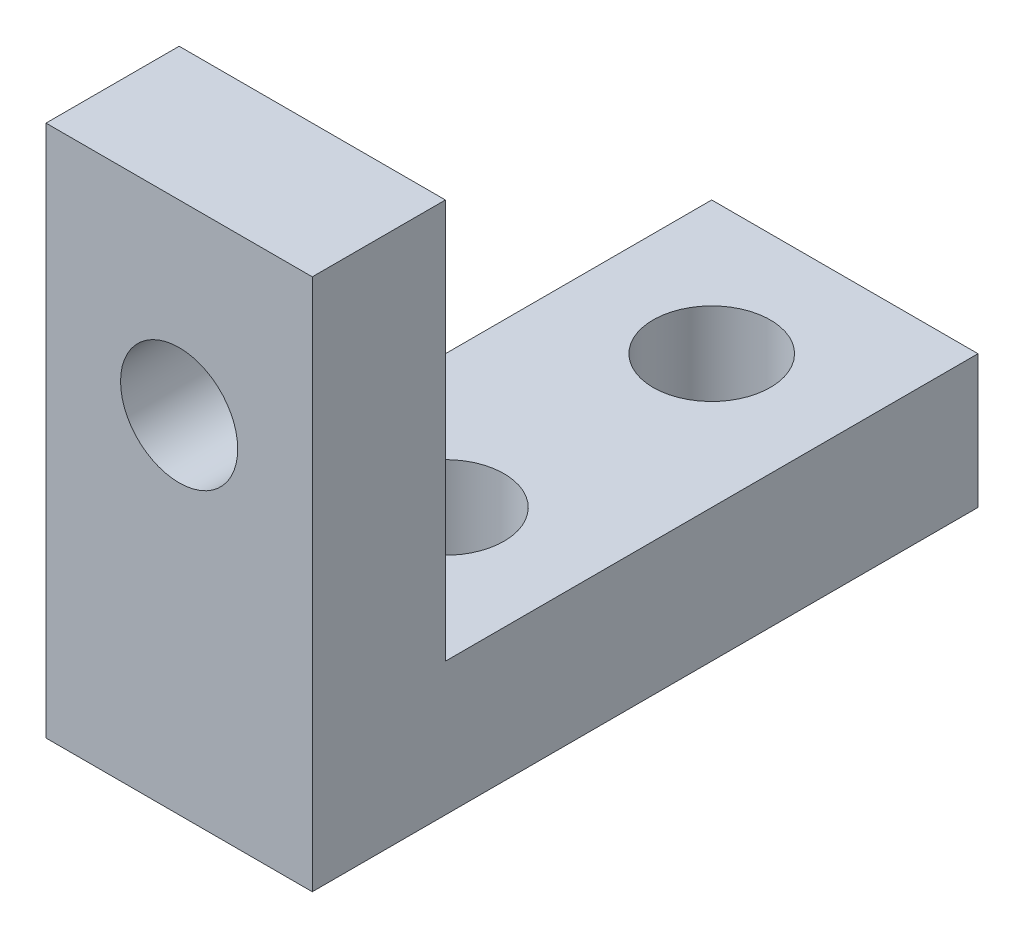
ISO-10303-21;
HEADER;
FILE_DESCRIPTION(('STEP AP214'),'2;1');
FILE_NAME('part.step','',(''),(''),'','','');
FILE_SCHEMA(('AUTOMOTIVE_DESIGN { 1 0 10303 214 1 1 1 1 }'));
ENDSEC;
DATA;
#1=APPLICATION_CONTEXT('core data for automotive mechanical design processes');
#2=APPLICATION_PROTOCOL_DEFINITION('international standard','automotive_design',2000,#1);
#3=PRODUCT_CONTEXT('',#1,'mechanical');
#4=PRODUCT('Part','Part','',(#3));
#5=PRODUCT_RELATED_PRODUCT_CATEGORY('part','',(#4));
#6=PRODUCT_DEFINITION_FORMATION('','',#4);
#7=PRODUCT_DEFINITION_CONTEXT('part definition',#1,'design');
#8=PRODUCT_DEFINITION('design','',#6,#7);
#9=PRODUCT_DEFINITION_SHAPE('','',#8);
#10=(LENGTH_UNIT() NAMED_UNIT(*) SI_UNIT(.MILLI.,.METRE.));
#11=(NAMED_UNIT(*) PLANE_ANGLE_UNIT() SI_UNIT($,.RADIAN.));
#12=(NAMED_UNIT(*) SI_UNIT($,.STERADIAN.) SOLID_ANGLE_UNIT());
#13=UNCERTAINTY_MEASURE_WITH_UNIT(LENGTH_MEASURE(1.E-05),#10,'distance_accuracy_value','');
#14=(GEOMETRIC_REPRESENTATION_CONTEXT(3) GLOBAL_UNCERTAINTY_ASSIGNED_CONTEXT((#13)) GLOBAL_UNIT_ASSIGNED_CONTEXT((#10,
#11,#12)) REPRESENTATION_CONTEXT('',''));
#15=CARTESIAN_POINT('',(0.,0.,0.));
#16=DIRECTION('',(0.,0.,1.));
#17=DIRECTION('',(1.,0.,0.));
#18=AXIS2_PLACEMENT_3D('',#15,#16,#17);
#19=CARTESIAN_POINT('',(10.,0.,0.));
#20=DIRECTION('',(0.,0.,1.));
#21=DIRECTION('',(1.,0.,0.));
#22=AXIS2_PLACEMENT_3D('',#19,#20,#21);
#23=PLANE('',#22);
#24=CARTESIAN_POINT('',(5.,13.,0.));
#25=DIRECTION('',(0.,0.,1.));
#26=DIRECTION('',(1.,0.,0.));
#27=AXIS2_PLACEMENT_3D('',#24,#25,#26);
#28=CIRCLE('',#27,2.2);
#29=CARTESIAN_POINT('',(7.2,13.,0.));
#30=VERTEX_POINT('',#29);
#31=EDGE_CURVE('E119',#30,#30,#28,.T.);
#32=ORIENTED_EDGE('',*,*,#31,.F.);
#33=EDGE_LOOP('',(#32));
#34=FACE_BOUND('',#33,.T.);
#35=DIRECTION('',(0.,1.,0.));
#36=VECTOR('',#35,1.);
#37=CARTESIAN_POINT('',(0.,0.,0.));
#38=LINE('',#37,#36);
#39=CARTESIAN_POINT('',(0.,0.,0.));
#40=VERTEX_POINT('',#39);
#41=CARTESIAN_POINT('',(0.,20.,0.));
#42=VERTEX_POINT('',#41);
#43=EDGE_CURVE('E116',#40,#42,#38,.T.);
#44=ORIENTED_EDGE('',*,*,#43,.F.);
#45=DIRECTION('',(-1.,0.,0.));
#46=VECTOR('',#45,1.);
#47=CARTESIAN_POINT('',(10.,0.,0.));
#48=LINE('',#47,#46);
#49=CARTESIAN_POINT('',(10.,0.,0.));
#50=VERTEX_POINT('',#49);
#51=EDGE_CURVE('E11',#50,#40,#48,.T.);
#52=ORIENTED_EDGE('',*,*,#51,.F.);
#53=DIRECTION('',(0.,1.,0.));
#54=VECTOR('',#53,1.);
#55=CARTESIAN_POINT('',(10.,0.,0.));
#56=LINE('',#55,#54);
#57=CARTESIAN_POINT('',(10.,20.,0.));
#58=VERTEX_POINT('',#57);
#59=EDGE_CURVE('E130',#50,#58,#56,.T.);
#60=ORIENTED_EDGE('',*,*,#59,.T.);
#61=DIRECTION('',(-1.,0.,0.));
#62=VECTOR('',#61,1.);
#63=CARTESIAN_POINT('',(10.,20.,0.));
#64=LINE('',#63,#62);
#65=EDGE_CURVE('E49',#58,#42,#64,.T.);
#66=ORIENTED_EDGE('',*,*,#65,.T.);
#67=EDGE_LOOP('',(#44,#52,#60,#66));
#68=FACE_BOUND('',#67,.T.);
#69=ADVANCED_FACE('F33',(#34,#68),#23,.T.);
#70=CARTESIAN_POINT('',(10.,0.,0.));
#71=DIRECTION('',(0.,1.,0.));
#72=DIRECTION('',(0.,0.,1.));
#73=AXIS2_PLACEMENT_3D('',#70,#71,#72);
#74=PLANE('',#73);
#75=CARTESIAN_POINT('',(5.,0.,-10.));
#76=DIRECTION('',(0.,1.,0.));
#77=DIRECTION('',(0.,0.,1.));
#78=AXIS2_PLACEMENT_3D('',#75,#76,#77);
#79=CIRCLE('',#78,2.2);
#80=CARTESIAN_POINT('',(5.,0.,-7.80000000000001));
#81=VERTEX_POINT('',#80);
#82=EDGE_CURVE('E175',#81,#81,#79,.T.);
#83=ORIENTED_EDGE('',*,*,#82,.T.);
#84=EDGE_LOOP('',(#83));
#85=FACE_BOUND('',#84,.T.);
#86=CARTESIAN_POINT('',(5.,0.,-20.));
#87=DIRECTION('',(0.,1.,0.));
#88=DIRECTION('',(0.,0.,1.));
#89=AXIS2_PLACEMENT_3D('',#86,#87,#88);
#90=CIRCLE('',#89,2.2);
#91=CARTESIAN_POINT('',(5.,0.,-17.8));
#92=VERTEX_POINT('',#91);
#93=EDGE_CURVE('E166',#92,#92,#90,.T.);
#94=ORIENTED_EDGE('',*,*,#93,.T.);
#95=EDGE_LOOP('',(#94));
#96=FACE_BOUND('',#95,.T.);
#97=DIRECTION('',(0.,0.,-1.));
#98=VECTOR('',#97,1.);
#99=CARTESIAN_POINT('',(0.,0.,0.));
#100=LINE('',#99,#98);
#101=CARTESIAN_POINT('',(0.,0.,-25.));
#102=VERTEX_POINT('',#101);
#103=EDGE_CURVE('E118',#40,#102,#100,.T.);
#104=ORIENTED_EDGE('',*,*,#103,.T.);
#105=DIRECTION('',(-1.,0.,0.));
#106=VECTOR('',#105,1.);
#107=CARTESIAN_POINT('',(10.,0.,-25.));
#108=LINE('',#107,#106);
#109=CARTESIAN_POINT('',(10.,0.,-25.));
#110=VERTEX_POINT('',#109);
#111=EDGE_CURVE('E41',#110,#102,#108,.T.);
#112=ORIENTED_EDGE('',*,*,#111,.F.);
#113=DIRECTION('',(0.,0.,-1.));
#114=VECTOR('',#113,1.);
#115=CARTESIAN_POINT('',(10.,0.,0.));
#116=LINE('',#115,#114);
#117=EDGE_CURVE('E111',#50,#110,#116,.T.);
#118=ORIENTED_EDGE('',*,*,#117,.F.);
#119=ORIENTED_EDGE('',*,*,#51,.T.);
#120=EDGE_LOOP('',(#104,#112,#118,#119));
#121=FACE_BOUND('',#120,.T.);
#122=ADVANCED_FACE('F154',(#85,#96,#121),#74,.F.);
#123=CARTESIAN_POINT('',(10.,0.,-25.));
#124=DIRECTION('',(0.,0.,1.));
#125=DIRECTION('',(1.,0.,0.));
#126=AXIS2_PLACEMENT_3D('',#123,#124,#125);
#127=PLANE('',#126);
#128=DIRECTION('',(0.,1.,0.));
#129=VECTOR('',#128,1.);
#130=CARTESIAN_POINT('',(0.,0.,-25.));
#131=LINE('',#130,#129);
#132=CARTESIAN_POINT('',(0.,5.,-25.));
#133=VERTEX_POINT('',#132);
#134=EDGE_CURVE('E121',#102,#133,#131,.T.);
#135=ORIENTED_EDGE('',*,*,#134,.T.);
#136=DIRECTION('',(-1.,0.,0.));
#137=VECTOR('',#136,1.);
#138=CARTESIAN_POINT('',(10.,5.,-25.));
#139=LINE('',#138,#137);
#140=CARTESIAN_POINT('',(10.,5.,-25.));
#141=VERTEX_POINT('',#140);
#142=EDGE_CURVE('E97',#141,#133,#139,.T.);
#143=ORIENTED_EDGE('',*,*,#142,.F.);
#144=DIRECTION('',(0.,1.,0.));
#145=VECTOR('',#144,1.);
#146=CARTESIAN_POINT('',(10.,0.,-25.));
#147=LINE('',#146,#145);
#148=EDGE_CURVE('E108',#110,#141,#147,.T.);
#149=ORIENTED_EDGE('',*,*,#148,.F.);
#150=ORIENTED_EDGE('',*,*,#111,.T.);
#151=EDGE_LOOP('',(#135,#143,#149,#150));
#152=FACE_BOUND('',#151,.T.);
#153=ADVANCED_FACE('F137',(#152),#127,.F.);
#154=CARTESIAN_POINT('',(10.,5.,0.));
#155=DIRECTION('',(0.,1.,0.));
#156=DIRECTION('',(0.,0.,1.));
#157=AXIS2_PLACEMENT_3D('',#154,#155,#156);
#158=PLANE('',#157);
#159=CARTESIAN_POINT('',(5.,5.,-10.));
#160=DIRECTION('',(0.,1.,0.));
#161=DIRECTION('',(0.,0.,1.));
#162=AXIS2_PLACEMENT_3D('',#159,#160,#161);
#163=CIRCLE('',#162,2.2);
#164=CARTESIAN_POINT('',(5.,5.,-7.80000000000001));
#165=VERTEX_POINT('',#164);
#166=EDGE_CURVE('E178',#165,#165,#163,.T.);
#167=ORIENTED_EDGE('',*,*,#166,.F.);
#168=EDGE_LOOP('',(#167));
#169=FACE_BOUND('',#168,.T.);
#170=CARTESIAN_POINT('',(5.,5.,-20.));
#171=DIRECTION('',(0.,1.,0.));
#172=DIRECTION('',(0.,0.,1.));
#173=AXIS2_PLACEMENT_3D('',#170,#171,#172);
#174=CIRCLE('',#173,2.2);
#175=CARTESIAN_POINT('',(5.,5.,-17.8));
#176=VERTEX_POINT('',#175);
#177=EDGE_CURVE('E172',#176,#176,#174,.T.);
#178=ORIENTED_EDGE('',*,*,#177,.F.);
#179=EDGE_LOOP('',(#178));
#180=FACE_BOUND('',#179,.T.);
#181=DIRECTION('',(0.,0.,-1.));
#182=VECTOR('',#181,1.);
#183=CARTESIAN_POINT('',(0.,5.,0.));
#184=LINE('',#183,#182);
#185=CARTESIAN_POINT('',(0.,5.,-5.));
#186=VERTEX_POINT('',#185);
#187=EDGE_CURVE('E94',#186,#133,#184,.T.);
#188=ORIENTED_EDGE('',*,*,#187,.F.);
#189=DIRECTION('',(-1.,0.,0.));
#190=VECTOR('',#189,1.);
#191=CARTESIAN_POINT('',(10.,5.,-5.));
#192=LINE('',#191,#190);
#193=CARTESIAN_POINT('',(10.,5.,-5.));
#194=VERTEX_POINT('',#193);
#195=EDGE_CURVE('E88',#194,#186,#192,.T.);
#196=ORIENTED_EDGE('',*,*,#195,.F.);
#197=DIRECTION('',(0.,0.,-1.));
#198=VECTOR('',#197,1.);
#199=CARTESIAN_POINT('',(10.,5.,0.));
#200=LINE('',#199,#198);
#201=EDGE_CURVE('E92',#194,#141,#200,.T.);
#202=ORIENTED_EDGE('',*,*,#201,.T.);
#203=ORIENTED_EDGE('',*,*,#142,.T.);
#204=EDGE_LOOP('',(#188,#196,#202,#203));
#205=FACE_BOUND('',#204,.T.);
#206=ADVANCED_FACE('F90',(#169,#180,#205),#158,.T.);
#207=CARTESIAN_POINT('',(10.,0.,-5.));
#208=DIRECTION('',(0.,0.,1.));
#209=DIRECTION('',(1.,0.,0.));
#210=AXIS2_PLACEMENT_3D('',#207,#208,#209);
#211=PLANE('',#210);
#212=CARTESIAN_POINT('',(5.,13.,-5.));
#213=DIRECTION('',(0.,0.,-1.));
#214=DIRECTION('',(-1.,0.,0.));
#215=AXIS2_PLACEMENT_3D('',#212,#213,#214);
#216=CIRCLE('',#215,2.2);
#217=CARTESIAN_POINT('',(2.8,13.,-5.));
#218=VERTEX_POINT('',#217);
#219=EDGE_CURVE('E163',#218,#218,#216,.T.);
#220=ORIENTED_EDGE('',*,*,#219,.F.);
#221=EDGE_LOOP('',(#220));
#222=FACE_BOUND('',#221,.T.);
#223=DIRECTION('',(0.,1.,0.));
#224=VECTOR('',#223,1.);
#225=CARTESIAN_POINT('',(0.,0.,-5.));
#226=LINE('',#225,#224);
#227=CARTESIAN_POINT('',(0.,20.,-5.));
#228=VERTEX_POINT('',#227);
#229=EDGE_CURVE('E125',#186,#228,#226,.T.);
#230=ORIENTED_EDGE('',*,*,#229,.T.);
#231=DIRECTION('',(-1.,0.,0.));
#232=VECTOR('',#231,1.);
#233=CARTESIAN_POINT('',(10.,20.,-5.));
#234=LINE('',#233,#232);
#235=CARTESIAN_POINT('',(10.,20.,-5.));
#236=VERTEX_POINT('',#235);
#237=EDGE_CURVE('E69',#236,#228,#234,.T.);
#238=ORIENTED_EDGE('',*,*,#237,.F.);
#239=DIRECTION('',(0.,1.,0.));
#240=VECTOR('',#239,1.);
#241=CARTESIAN_POINT('',(10.,0.,-5.));
#242=LINE('',#241,#240);
#243=EDGE_CURVE('E99',#194,#236,#242,.T.);
#244=ORIENTED_EDGE('',*,*,#243,.F.);
#245=ORIENTED_EDGE('',*,*,#195,.T.);
#246=EDGE_LOOP('',(#230,#238,#244,#245));
#247=FACE_BOUND('',#246,.T.);
#248=ADVANCED_FACE('F100',(#222,#247),#211,.F.);
#249=CARTESIAN_POINT('',(10.,20.,0.));
#250=DIRECTION('',(0.,1.,0.));
#251=DIRECTION('',(0.,0.,1.));
#252=AXIS2_PLACEMENT_3D('',#249,#250,#251);
#253=PLANE('',#252);
#254=DIRECTION('',(0.,0.,-1.));
#255=VECTOR('',#254,1.);
#256=CARTESIAN_POINT('',(0.,20.,0.));
#257=LINE('',#256,#255);
#258=EDGE_CURVE('E127',#42,#228,#257,.T.);
#259=ORIENTED_EDGE('',*,*,#258,.F.);
#260=ORIENTED_EDGE('',*,*,#65,.F.);
#261=DIRECTION('',(0.,0.,-1.));
#262=VECTOR('',#261,1.);
#263=CARTESIAN_POINT('',(10.,20.,0.));
#264=LINE('',#263,#262);
#265=EDGE_CURVE('E103',#58,#236,#264,.T.);
#266=ORIENTED_EDGE('',*,*,#265,.T.);
#267=ORIENTED_EDGE('',*,*,#237,.T.);
#268=EDGE_LOOP('',(#259,#260,#266,#267));
#269=FACE_BOUND('',#268,.T.);
#270=ADVANCED_FACE('F142',(#269),#253,.T.);
#271=CARTESIAN_POINT('',(10.,0.,0.));
#272=DIRECTION('',(1.,0.,0.));
#273=DIRECTION('',(0.,0.,-1.));
#274=AXIS2_PLACEMENT_3D('',#271,#272,#273);
#275=PLANE('',#274);
#276=ORIENTED_EDGE('',*,*,#59,.F.);
#277=ORIENTED_EDGE('',*,*,#117,.T.);
#278=ORIENTED_EDGE('',*,*,#148,.T.);
#279=ORIENTED_EDGE('',*,*,#201,.F.);
#280=ORIENTED_EDGE('',*,*,#243,.T.);
#281=ORIENTED_EDGE('',*,*,#265,.F.);
#282=EDGE_LOOP('',(#276,#277,#278,#279,#280,#281));
#283=FACE_BOUND('',#282,.T.);
#284=ADVANCED_FACE('F106',(#283),#275,.T.);
#285=CARTESIAN_POINT('',(0.,0.,0.));
#286=DIRECTION('',(1.,0.,0.));
#287=DIRECTION('',(0.,0.,-1.));
#288=AXIS2_PLACEMENT_3D('',#285,#286,#287);
#289=PLANE('',#288);
#290=ORIENTED_EDGE('',*,*,#43,.T.);
#291=ORIENTED_EDGE('',*,*,#258,.T.);
#292=ORIENTED_EDGE('',*,*,#229,.F.);
#293=ORIENTED_EDGE('',*,*,#187,.T.);
#294=ORIENTED_EDGE('',*,*,#134,.F.);
#295=ORIENTED_EDGE('',*,*,#103,.F.);
#296=EDGE_LOOP('',(#290,#291,#292,#293,#294,#295));
#297=FACE_BOUND('',#296,.T.);
#298=ADVANCED_FACE('F141',(#297),#289,.F.);
#299=CARTESIAN_POINT('',(5.,13.,5.));
#300=DIRECTION('',(0.,0.,-1.));
#301=DIRECTION('',(-1.,0.,0.));
#302=AXIS2_PLACEMENT_3D('',#299,#300,#301);
#303=CYLINDRICAL_SURFACE('',#302,2.2);
#304=ORIENTED_EDGE('',*,*,#31,.T.);
#305=EDGE_LOOP('',(#304));
#306=FACE_BOUND('',#305,.T.);
#307=ORIENTED_EDGE('',*,*,#219,.T.);
#308=EDGE_LOOP('',(#307));
#309=FACE_BOUND('',#308,.T.);
#310=ADVANCED_FACE('F193',(#306,#309),#303,.F.);
#311=CARTESIAN_POINT('',(5.,-5.,-20.));
#312=DIRECTION('',(0.,1.,0.));
#313=DIRECTION('',(0.,0.,1.));
#314=AXIS2_PLACEMENT_3D('',#311,#312,#313);
#315=CYLINDRICAL_SURFACE('',#314,2.2);
#316=ORIENTED_EDGE('',*,*,#177,.T.);
#317=EDGE_LOOP('',(#316));
#318=FACE_BOUND('',#317,.T.);
#319=ORIENTED_EDGE('',*,*,#93,.F.);
#320=EDGE_LOOP('',(#319));
#321=FACE_BOUND('',#320,.T.);
#322=ADVANCED_FACE('F190',(#318,#321),#315,.F.);
#323=CARTESIAN_POINT('',(5.,-5.,-10.));
#324=DIRECTION('',(0.,1.,0.));
#325=DIRECTION('',(0.,0.,1.));
#326=AXIS2_PLACEMENT_3D('',#323,#324,#325);
#327=CYLINDRICAL_SURFACE('',#326,2.2);
#328=ORIENTED_EDGE('',*,*,#166,.T.);
#329=EDGE_LOOP('',(#328));
#330=FACE_BOUND('',#329,.T.);
#331=ORIENTED_EDGE('',*,*,#82,.F.);
#332=EDGE_LOOP('',(#331));
#333=FACE_BOUND('',#332,.T.);
#334=ADVANCED_FACE('F182',(#330,#333),#327,.F.);
#335=CLOSED_SHELL('',(#69,#122,#153,#206,#248,#270,#284,#298,#310,#322,#334));
#336=MANIFOLD_SOLID_BREP('B2',#335);
#337=ADVANCED_BREP_SHAPE_REPRESENTATION('',(#18,#336),#14);
#338=SHAPE_DEFINITION_REPRESENTATION(#9,#337);
ENDSEC;
END-ISO-10303-21;
